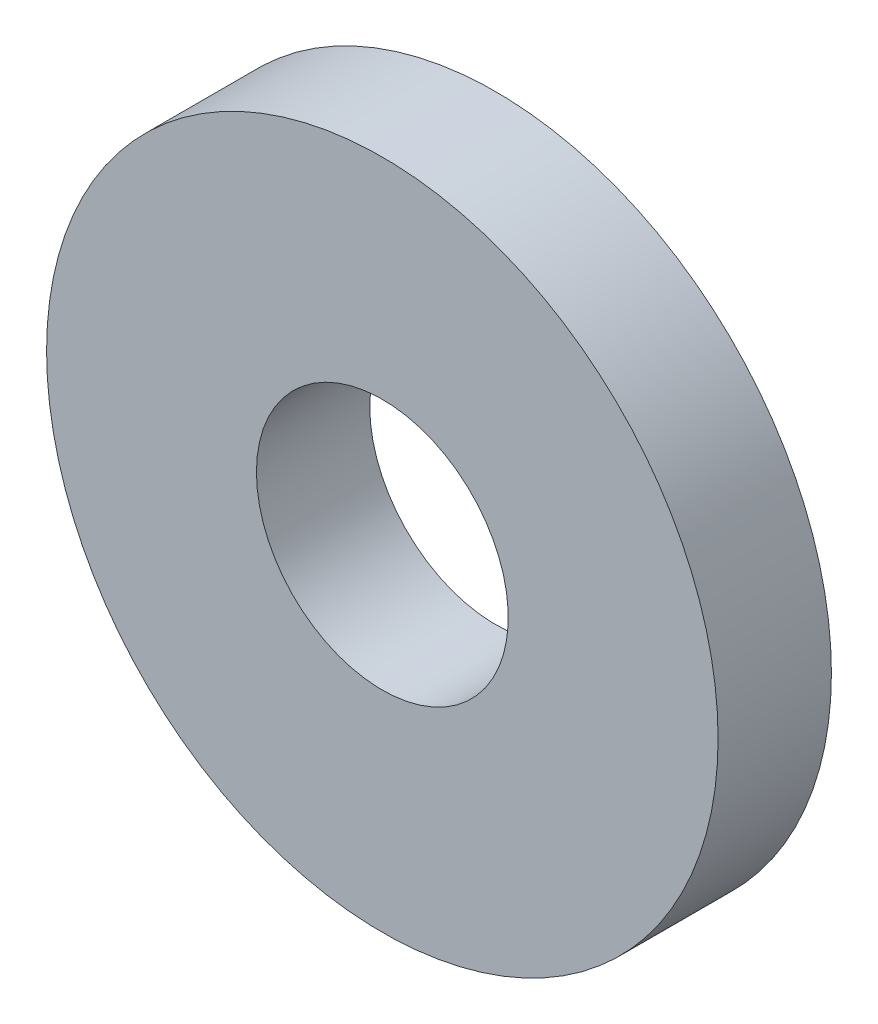
ISO-10303-21;
HEADER;
FILE_DESCRIPTION(('STEP AP214'),'2;1');
FILE_NAME('part.step','',(''),(''),'','','');
FILE_SCHEMA(('AUTOMOTIVE_DESIGN { 1 0 10303 214 1 1 1 1 }'));
ENDSEC;
DATA;
#1=APPLICATION_CONTEXT('core data for automotive mechanical design processes');
#2=APPLICATION_PROTOCOL_DEFINITION('international standard','automotive_design',2000,#1);
#3=PRODUCT_CONTEXT('',#1,'mechanical');
#4=PRODUCT('Part','Part','',(#3));
#5=PRODUCT_RELATED_PRODUCT_CATEGORY('part','',(#4));
#6=PRODUCT_DEFINITION_FORMATION('','',#4);
#7=PRODUCT_DEFINITION_CONTEXT('part definition',#1,'design');
#8=PRODUCT_DEFINITION('design','',#6,#7);
#9=PRODUCT_DEFINITION_SHAPE('','',#8);
#10=(LENGTH_UNIT() NAMED_UNIT(*) SI_UNIT(.MILLI.,.METRE.));
#11=(NAMED_UNIT(*) PLANE_ANGLE_UNIT() SI_UNIT($,.RADIAN.));
#12=(NAMED_UNIT(*) SI_UNIT($,.STERADIAN.) SOLID_ANGLE_UNIT());
#13=UNCERTAINTY_MEASURE_WITH_UNIT(LENGTH_MEASURE(1.E-05),#10,'distance_accuracy_value','');
#14=(GEOMETRIC_REPRESENTATION_CONTEXT(3) GLOBAL_UNCERTAINTY_ASSIGNED_CONTEXT((#13)) GLOBAL_UNIT_ASSIGNED_CONTEXT((#10,
#11,#12)) REPRESENTATION_CONTEXT('',''));
#15=CARTESIAN_POINT('',(0.,0.,0.));
#16=DIRECTION('',(0.,0.,1.));
#17=DIRECTION('',(1.,0.,0.));
#18=AXIS2_PLACEMENT_3D('',#15,#16,#17);
#19=CARTESIAN_POINT('',(0.,0.,5.4));
#20=DIRECTION('',(0.,0.,1.));
#21=DIRECTION('',(1.,0.,0.));
#22=AXIS2_PLACEMENT_3D('',#19,#20,#21);
#23=PLANE('',#22);
#24=CARTESIAN_POINT('',(0.,0.,5.4));
#25=DIRECTION('',(0.,0.,1.));
#26=DIRECTION('',(1.,0.,0.));
#27=AXIS2_PLACEMENT_3D('',#24,#25,#26);
#28=CIRCLE('',#27,16.);
#29=CARTESIAN_POINT('',(-16.,0.,5.4));
#30=VERTEX_POINT('',#29);
#31=EDGE_CURVE('E10',#30,#30,#28,.T.);
#32=ORIENTED_EDGE('',*,*,#31,.T.);
#33=EDGE_LOOP('',(#32));
#34=FACE_BOUND('',#33,.T.);
#35=CARTESIAN_POINT('',(0.,0.,5.4));
#36=DIRECTION('',(0.,0.,1.));
#37=DIRECTION('',(1.,0.,0.));
#38=AXIS2_PLACEMENT_3D('',#35,#36,#37);
#39=CIRCLE('',#38,6.);
#40=CARTESIAN_POINT('',(-6.,0.,5.4));
#41=VERTEX_POINT('',#40);
#42=EDGE_CURVE('E41',#41,#41,#39,.T.);
#43=ORIENTED_EDGE('',*,*,#42,.F.);
#44=EDGE_LOOP('',(#43));
#45=FACE_BOUND('',#44,.T.);
#46=ADVANCED_FACE('F30',(#34,#45),#23,.T.);
#47=CARTESIAN_POINT('',(0.,0.,0.));
#48=DIRECTION('',(0.,0.,1.));
#49=DIRECTION('',(1.,0.,0.));
#50=AXIS2_PLACEMENT_3D('',#47,#48,#49);
#51=PLANE('',#50);
#52=CARTESIAN_POINT('',(0.,0.,0.));
#53=DIRECTION('',(0.,0.,1.));
#54=DIRECTION('',(1.,0.,0.));
#55=AXIS2_PLACEMENT_3D('',#52,#53,#54);
#56=CIRCLE('',#55,16.);
#57=CARTESIAN_POINT('',(-16.,0.,0.));
#58=VERTEX_POINT('',#57);
#59=EDGE_CURVE('E34',#58,#58,#56,.T.);
#60=ORIENTED_EDGE('',*,*,#59,.F.);
#61=EDGE_LOOP('',(#60));
#62=FACE_BOUND('',#61,.T.);
#63=CARTESIAN_POINT('',(0.,0.,0.));
#64=DIRECTION('',(0.,0.,1.));
#65=DIRECTION('',(1.,0.,0.));
#66=AXIS2_PLACEMENT_3D('',#63,#64,#65);
#67=CIRCLE('',#66,6.);
#68=CARTESIAN_POINT('',(-6.,0.,0.));
#69=VERTEX_POINT('',#68);
#70=EDGE_CURVE('E43',#69,#69,#67,.T.);
#71=ORIENTED_EDGE('',*,*,#70,.T.);
#72=EDGE_LOOP('',(#71));
#73=FACE_BOUND('',#72,.T.);
#74=ADVANCED_FACE('F53',(#62,#73),#51,.F.);
#75=CARTESIAN_POINT('',(0.,0.,5.4));
#76=DIRECTION('',(0.,0.,-1.));
#77=DIRECTION('',(-1.,0.,0.));
#78=AXIS2_PLACEMENT_3D('',#75,#76,#77);
#79=CYLINDRICAL_SURFACE('',#78,16.);
#80=CARTESIAN_POINT('',(-16.,0.,5.4));
#81=CARTESIAN_POINT('',(-16.,0.,5.34375));
#82=CARTESIAN_POINT('',(-16.,0.,5.2875));
#83=CARTESIAN_POINT('',(-16.,0.,5.175));
#84=CARTESIAN_POINT('',(-16.,0.,5.11875));
#85=CARTESIAN_POINT('',(-16.,0.,5.00625));
#86=CARTESIAN_POINT('',(-16.,0.,4.95));
#87=CARTESIAN_POINT('',(-16.,0.,4.8375));
#88=CARTESIAN_POINT('',(-16.,0.,4.78125));
#89=CARTESIAN_POINT('',(-16.,0.,4.66875));
#90=CARTESIAN_POINT('',(-16.,0.,4.6125));
#91=CARTESIAN_POINT('',(-16.,0.,4.5));
#92=CARTESIAN_POINT('',(-16.,0.,4.44375));
#93=CARTESIAN_POINT('',(-16.,0.,4.33125));
#94=CARTESIAN_POINT('',(-16.,0.,4.275));
#95=CARTESIAN_POINT('',(-16.,0.,4.1625));
#96=CARTESIAN_POINT('',(-16.,0.,4.10625));
#97=CARTESIAN_POINT('',(-16.,0.,3.99375));
#98=CARTESIAN_POINT('',(-16.,0.,3.9375));
#99=CARTESIAN_POINT('',(-16.,0.,3.825));
#100=CARTESIAN_POINT('',(-16.,0.,3.76875));
#101=CARTESIAN_POINT('',(-16.,0.,3.65625));
#102=CARTESIAN_POINT('',(-16.,0.,3.6));
#103=CARTESIAN_POINT('',(-16.,0.,3.4875));
#104=CARTESIAN_POINT('',(-16.,0.,3.43125));
#105=CARTESIAN_POINT('',(-16.,0.,3.31875));
#106=CARTESIAN_POINT('',(-16.,0.,3.2625));
#107=CARTESIAN_POINT('',(-16.,0.,3.15));
#108=CARTESIAN_POINT('',(-16.,0.,3.09375));
#109=CARTESIAN_POINT('',(-16.,0.,2.98125));
#110=CARTESIAN_POINT('',(-16.,0.,2.925));
#111=CARTESIAN_POINT('',(-16.,0.,2.8125));
#112=CARTESIAN_POINT('',(-16.,0.,2.75625));
#113=CARTESIAN_POINT('',(-16.,0.,2.64375));
#114=CARTESIAN_POINT('',(-16.,0.,2.5875));
#115=CARTESIAN_POINT('',(-16.,0.,2.475));
#116=CARTESIAN_POINT('',(-16.,0.,2.41875));
#117=CARTESIAN_POINT('',(-16.,0.,2.30625));
#118=CARTESIAN_POINT('',(-16.,0.,2.25));
#119=CARTESIAN_POINT('',(-16.,0.,2.1375));
#120=CARTESIAN_POINT('',(-16.,0.,2.08125));
#121=CARTESIAN_POINT('',(-16.,0.,1.96875));
#122=CARTESIAN_POINT('',(-16.,0.,1.9125));
#123=CARTESIAN_POINT('',(-16.,0.,1.8));
#124=CARTESIAN_POINT('',(-16.,0.,1.74375));
#125=CARTESIAN_POINT('',(-16.,0.,1.63125));
#126=CARTESIAN_POINT('',(-16.,0.,1.575));
#127=CARTESIAN_POINT('',(-16.,0.,1.4625));
#128=CARTESIAN_POINT('',(-16.,0.,1.40625));
#129=CARTESIAN_POINT('',(-16.,0.,1.29375));
#130=CARTESIAN_POINT('',(-16.,0.,1.2375));
#131=CARTESIAN_POINT('',(-16.,0.,1.125));
#132=CARTESIAN_POINT('',(-16.,0.,1.06875));
#133=CARTESIAN_POINT('',(-16.,0.,0.956249999999999));
#134=CARTESIAN_POINT('',(-16.,0.,0.899999999999999));
#135=CARTESIAN_POINT('',(-16.,0.,0.787499999999999));
#136=CARTESIAN_POINT('',(-16.,0.,0.731249999999999));
#137=CARTESIAN_POINT('',(-16.,0.,0.618749999999999));
#138=CARTESIAN_POINT('',(-16.,0.,0.562499999999999));
#139=CARTESIAN_POINT('',(-16.,0.,0.449999999999999));
#140=CARTESIAN_POINT('',(-16.,0.,0.393749999999999));
#141=CARTESIAN_POINT('',(-16.,0.,0.281249999999999));
#142=CARTESIAN_POINT('',(-16.,0.,0.224999999999999));
#143=CARTESIAN_POINT('',(-16.,0.,0.112499999999999));
#144=CARTESIAN_POINT('',(-16.,0.,0.0562499999999989));
#145=CARTESIAN_POINT('',(-16.,0.,0.));
#146=B_SPLINE_CURVE_WITH_KNOTS('',3,(#80,#81,#82,#83,#84,#85,#86,#87,#88,#89,#90,#91,#92,#93,
#94,#95,#96,#97,#98,#99,#100,#101,#102,#103,#104,#105,#106,#107,#108,#109,#110,#111,#112,#113,
#114,#115,#116,#117,#118,#119,#120,#121,#122,#123,#124,#125,#126,#127,#128,#129,#130,#131,#132,
#133,#134,#135,#136,#137,#138,#139,#140,#141,#142,#143,#144,#145),.UNSPECIFIED.,.F.,.F.,(4,2,2,
2,2,2,2,2,2,2,2,2,2,2,2,2,2,2,2,2,2,2,2,2,2,2,2,2,2,2,2,2,4),(0.,0.16875,0.337499999999999,
0.50625,0.674999999999999,0.84375,1.0125,1.18125,1.35,1.51875,1.6875,1.85625,2.025,2.19375,
2.3625,2.53125,2.7,2.86875,3.0375,3.20625,3.375,3.54375,3.7125,3.88125,4.05,4.21875,4.3875,
4.55625,4.725,4.89375,5.0625,5.23125,5.4),.UNSPECIFIED.);
#147=EDGE_CURVE('BSEAM32',#30,#58,#146,.T.);
#148=ORIENTED_EDGE('',*,*,#31,.F.);
#149=ORIENTED_EDGE('',*,*,#59,.T.);
#150=ORIENTED_EDGE('',*,*,#147,.T.);
#151=ORIENTED_EDGE('',*,*,#147,.F.);
#152=EDGE_LOOP('',(#148,#150,#149,#151));
#153=FACE_BOUND('',#152,.T.);
#154=ADVANCED_FACE('F32',(#153),#79,.T.);
#155=CARTESIAN_POINT('',(0.,0.,5.4));
#156=DIRECTION('',(0.,0.,-1.));
#157=DIRECTION('',(-1.,0.,0.));
#158=AXIS2_PLACEMENT_3D('',#155,#156,#157);
#159=CYLINDRICAL_SURFACE('',#158,6.);
#160=CARTESIAN_POINT('',(-6.,0.,5.4));
#161=CARTESIAN_POINT('',(-6.,0.,5.34375));
#162=CARTESIAN_POINT('',(-6.,0.,5.2875));
#163=CARTESIAN_POINT('',(-6.,0.,5.175));
#164=CARTESIAN_POINT('',(-6.,0.,5.11875));
#165=CARTESIAN_POINT('',(-6.,0.,5.00625));
#166=CARTESIAN_POINT('',(-6.,0.,4.95));
#167=CARTESIAN_POINT('',(-6.,0.,4.8375));
#168=CARTESIAN_POINT('',(-6.,0.,4.78125));
#169=CARTESIAN_POINT('',(-6.,0.,4.66875));
#170=CARTESIAN_POINT('',(-6.,0.,4.6125));
#171=CARTESIAN_POINT('',(-6.,0.,4.5));
#172=CARTESIAN_POINT('',(-6.,0.,4.44375));
#173=CARTESIAN_POINT('',(-6.,0.,4.33125));
#174=CARTESIAN_POINT('',(-6.,0.,4.275));
#175=CARTESIAN_POINT('',(-6.,0.,4.1625));
#176=CARTESIAN_POINT('',(-6.,0.,4.10625));
#177=CARTESIAN_POINT('',(-6.,0.,3.99375));
#178=CARTESIAN_POINT('',(-6.,0.,3.9375));
#179=CARTESIAN_POINT('',(-6.,0.,3.825));
#180=CARTESIAN_POINT('',(-6.,0.,3.76875));
#181=CARTESIAN_POINT('',(-6.,0.,3.65625));
#182=CARTESIAN_POINT('',(-6.,0.,3.6));
#183=CARTESIAN_POINT('',(-6.,0.,3.4875));
#184=CARTESIAN_POINT('',(-6.,0.,3.43125));
#185=CARTESIAN_POINT('',(-6.,0.,3.31875));
#186=CARTESIAN_POINT('',(-6.,0.,3.2625));
#187=CARTESIAN_POINT('',(-6.,0.,3.15));
#188=CARTESIAN_POINT('',(-6.,0.,3.09375));
#189=CARTESIAN_POINT('',(-6.,0.,2.98125));
#190=CARTESIAN_POINT('',(-6.,0.,2.925));
#191=CARTESIAN_POINT('',(-6.,0.,2.8125));
#192=CARTESIAN_POINT('',(-6.,0.,2.75625));
#193=CARTESIAN_POINT('',(-6.,0.,2.64375));
#194=CARTESIAN_POINT('',(-6.,0.,2.5875));
#195=CARTESIAN_POINT('',(-6.,0.,2.475));
#196=CARTESIAN_POINT('',(-6.,0.,2.41875));
#197=CARTESIAN_POINT('',(-6.,0.,2.30625));
#198=CARTESIAN_POINT('',(-6.,0.,2.25));
#199=CARTESIAN_POINT('',(-6.,0.,2.1375));
#200=CARTESIAN_POINT('',(-6.,0.,2.08125));
#201=CARTESIAN_POINT('',(-6.,0.,1.96875));
#202=CARTESIAN_POINT('',(-6.,0.,1.9125));
#203=CARTESIAN_POINT('',(-6.,0.,1.8));
#204=CARTESIAN_POINT('',(-6.,0.,1.74375));
#205=CARTESIAN_POINT('',(-6.,0.,1.63125));
#206=CARTESIAN_POINT('',(-6.,0.,1.575));
#207=CARTESIAN_POINT('',(-6.,0.,1.4625));
#208=CARTESIAN_POINT('',(-6.,0.,1.40625));
#209=CARTESIAN_POINT('',(-6.,0.,1.29375));
#210=CARTESIAN_POINT('',(-6.,0.,1.2375));
#211=CARTESIAN_POINT('',(-6.,0.,1.125));
#212=CARTESIAN_POINT('',(-6.,0.,1.06875));
#213=CARTESIAN_POINT('',(-6.,0.,0.956249999999999));
#214=CARTESIAN_POINT('',(-6.,0.,0.899999999999999));
#215=CARTESIAN_POINT('',(-6.,0.,0.787499999999999));
#216=CARTESIAN_POINT('',(-6.,0.,0.731249999999999));
#217=CARTESIAN_POINT('',(-6.,0.,0.618749999999999));
#218=CARTESIAN_POINT('',(-6.,0.,0.562499999999999));
#219=CARTESIAN_POINT('',(-6.,0.,0.449999999999999));
#220=CARTESIAN_POINT('',(-6.,0.,0.393749999999999));
#221=CARTESIAN_POINT('',(-6.,0.,0.281249999999999));
#222=CARTESIAN_POINT('',(-6.,0.,0.224999999999999));
#223=CARTESIAN_POINT('',(-6.,0.,0.112499999999999));
#224=CARTESIAN_POINT('',(-6.,0.,0.0562499999999989));
#225=CARTESIAN_POINT('',(-6.,0.,0.));
#226=B_SPLINE_CURVE_WITH_KNOTS('',3,(#160,#161,#162,#163,#164,#165,#166,#167,#168,#169,#170,
#171,#172,#173,#174,#175,#176,#177,#178,#179,#180,#181,#182,#183,#184,#185,#186,#187,#188,#189,
#190,#191,#192,#193,#194,#195,#196,#197,#198,#199,#200,#201,#202,#203,#204,#205,#206,#207,#208,
#209,#210,#211,#212,#213,#214,#215,#216,#217,#218,#219,#220,#221,#222,#223,#224,#225),
.UNSPECIFIED.,.F.,.F.,(4,2,2,2,2,2,2,2,2,2,2,2,2,2,2,2,2,2,2,2,2,2,2,2,2,2,2,2,2,2,2,2,4),(0.,
0.16875,0.337499999999999,0.50625,0.674999999999999,0.84375,1.0125,1.18125,1.35,1.51875,1.6875,
1.85625,2.025,2.19375,2.3625,2.53125,2.7,2.86875,3.0375,3.20625,3.375,3.54375,3.7125,3.88125,
4.05,4.21875,4.3875,4.55625,4.725,4.89375,5.0625,5.23125,5.4),.UNSPECIFIED.);
#227=EDGE_CURVE('BSEAM49',#41,#69,#226,.T.);
#228=ORIENTED_EDGE('',*,*,#42,.T.);
#229=ORIENTED_EDGE('',*,*,#70,.F.);
#230=ORIENTED_EDGE('',*,*,#227,.T.);
#231=ORIENTED_EDGE('',*,*,#227,.F.);
#232=EDGE_LOOP('',(#228,#230,#229,#231));
#233=FACE_BOUND('',#232,.T.);
#234=ADVANCED_FACE('F49',(#233),#159,.F.);
#235=CLOSED_SHELL('',(#46,#74,#154,#234));
#236=MANIFOLD_SOLID_BREP('B2',#235);
#237=ADVANCED_BREP_SHAPE_REPRESENTATION('',(#18,#236),#14);
#238=SHAPE_DEFINITION_REPRESENTATION(#9,#237);
ENDSEC;
END-ISO-10303-21;
